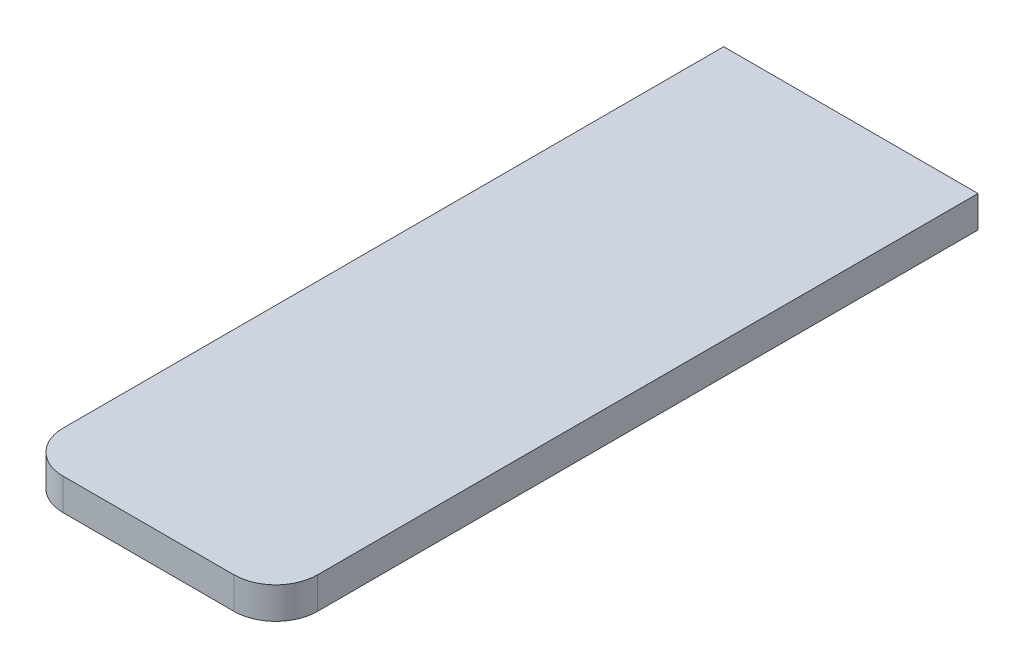
ISO-10303-21;
HEADER;
FILE_DESCRIPTION(('STEP AP214'),'2;1');
FILE_NAME('part.step','',(''),(''),'','','');
FILE_SCHEMA(('AUTOMOTIVE_DESIGN { 1 0 10303 214 1 1 1 1 }'));
ENDSEC;
DATA;
#1=APPLICATION_CONTEXT('core data for automotive mechanical design processes');
#2=APPLICATION_PROTOCOL_DEFINITION('international standard','automotive_design',2000,#1);
#3=PRODUCT_CONTEXT('',#1,'mechanical');
#4=PRODUCT('Part','Part','',(#3));
#5=PRODUCT_RELATED_PRODUCT_CATEGORY('part','',(#4));
#6=PRODUCT_DEFINITION_FORMATION('','',#4);
#7=PRODUCT_DEFINITION_CONTEXT('part definition',#1,'design');
#8=PRODUCT_DEFINITION('design','',#6,#7);
#9=PRODUCT_DEFINITION_SHAPE('','',#8);
#10=(LENGTH_UNIT() NAMED_UNIT(*) SI_UNIT(.MILLI.,.METRE.));
#11=(NAMED_UNIT(*) PLANE_ANGLE_UNIT() SI_UNIT($,.RADIAN.));
#12=(NAMED_UNIT(*) SI_UNIT($,.STERADIAN.) SOLID_ANGLE_UNIT());
#13=UNCERTAINTY_MEASURE_WITH_UNIT(LENGTH_MEASURE(1.E-05),#10,'distance_accuracy_value','');
#14=(GEOMETRIC_REPRESENTATION_CONTEXT(3) GLOBAL_UNCERTAINTY_ASSIGNED_CONTEXT((#13)) GLOBAL_UNIT_ASSIGNED_CONTEXT((#10,
#11,#12)) REPRESENTATION_CONTEXT('',''));
#15=CARTESIAN_POINT('',(0.,0.,0.));
#16=DIRECTION('',(0.,0.,1.));
#17=DIRECTION('',(1.,0.,0.));
#18=AXIS2_PLACEMENT_3D('',#15,#16,#17);
#19=CARTESIAN_POINT('',(12.05,3.,31.3));
#20=DIRECTION('',(-1.,0.,0.));
#21=DIRECTION('',(0.,0.,1.));
#22=AXIS2_PLACEMENT_3D('',#19,#20,#21);
#23=PLANE('',#22);
#24=DIRECTION('',(0.,0.,-1.));
#25=VECTOR('',#24,1.);
#26=CARTESIAN_POINT('',(12.05,3.,31.3));
#27=LINE('',#26,#25);
#28=CARTESIAN_POINT('',(12.05,3.,31.3));
#29=VERTEX_POINT('',#28);
#30=CARTESIAN_POINT('',(12.05,3.,-31.3));
#31=VERTEX_POINT('',#30);
#32=EDGE_CURVE('E84',#29,#31,#27,.T.);
#33=ORIENTED_EDGE('',*,*,#32,.F.);
#34=DIRECTION('',(0.,1.,0.));
#35=VECTOR('',#34,1.);
#36=CARTESIAN_POINT('',(12.05,0.,31.3));
#37=LINE('',#36,#35);
#38=CARTESIAN_POINT('',(12.05,0.,31.3));
#39=VERTEX_POINT('',#38);
#40=EDGE_CURVE('E116',#29,#39,#37,.F.);
#41=ORIENTED_EDGE('',*,*,#40,.T.);
#42=DIRECTION('',(0.,0.,-1.));
#43=VECTOR('',#42,1.);
#44=CARTESIAN_POINT('',(12.05,0.,31.3));
#45=LINE('',#44,#43);
#46=CARTESIAN_POINT('',(12.05,0.,-31.3));
#47=VERTEX_POINT('',#46);
#48=EDGE_CURVE('E106',#39,#47,#45,.T.);
#49=ORIENTED_EDGE('',*,*,#48,.T.);
#50=DIRECTION('',(0.,-1.,0.));
#51=VECTOR('',#50,1.);
#52=CARTESIAN_POINT('',(12.05,3.,-31.3));
#53=LINE('',#52,#51);
#54=EDGE_CURVE('E99',#31,#47,#53,.T.);
#55=ORIENTED_EDGE('',*,*,#54,.F.);
#56=EDGE_LOOP('',(#33,#41,#49,#55));
#57=FACE_BOUND('',#56,.T.);
#58=ADVANCED_FACE('F35',(#57),#23,.F.);
#59=CARTESIAN_POINT('',(-12.05,3.,-31.3));
#60=DIRECTION('',(0.,0.,1.));
#61=DIRECTION('',(1.,0.,0.));
#62=AXIS2_PLACEMENT_3D('',#59,#60,#61);
#63=PLANE('',#62);
#64=DIRECTION('',(-1.,0.,0.));
#65=VECTOR('',#64,1.);
#66=CARTESIAN_POINT('',(-12.05,0.,-31.3));
#67=LINE('',#66,#65);
#68=CARTESIAN_POINT('',(-12.05,0.,-31.3));
#69=VERTEX_POINT('',#68);
#70=EDGE_CURVE('E134',#47,#69,#67,.T.);
#71=ORIENTED_EDGE('',*,*,#70,.T.);
#72=DIRECTION('',(0.,-1.,0.));
#73=VECTOR('',#72,1.);
#74=CARTESIAN_POINT('',(-12.05,3.,-31.3));
#75=LINE('',#74,#73);
#76=CARTESIAN_POINT('',(-12.05,3.,-31.3));
#77=VERTEX_POINT('',#76);
#78=EDGE_CURVE('E101',#77,#69,#75,.T.);
#79=ORIENTED_EDGE('',*,*,#78,.F.);
#80=DIRECTION('',(-1.,0.,0.));
#81=VECTOR('',#80,1.);
#82=CARTESIAN_POINT('',(-12.05,3.,-31.3));
#83=LINE('',#82,#81);
#84=EDGE_CURVE('E87',#31,#77,#83,.T.);
#85=ORIENTED_EDGE('',*,*,#84,.F.);
#86=ORIENTED_EDGE('',*,*,#54,.T.);
#87=EDGE_LOOP('',(#71,#79,#85,#86));
#88=FACE_BOUND('',#87,.T.);
#89=ADVANCED_FACE('F98',(#88),#63,.F.);
#90=CARTESIAN_POINT('',(-12.05,3.,31.3));
#91=DIRECTION('',(1.,0.,0.));
#92=DIRECTION('',(0.,0.,-1.));
#93=AXIS2_PLACEMENT_3D('',#90,#91,#92);
#94=PLANE('',#93);
#95=DIRECTION('',(0.,0.,1.));
#96=VECTOR('',#95,1.);
#97=CARTESIAN_POINT('',(-12.05,0.,31.3));
#98=LINE('',#97,#96);
#99=CARTESIAN_POINT('',(-12.05,0.,31.3));
#100=VERTEX_POINT('',#99);
#101=EDGE_CURVE('E94',#69,#100,#98,.T.);
#102=ORIENTED_EDGE('',*,*,#101,.T.);
#103=DIRECTION('',(0.,1.,0.));
#104=VECTOR('',#103,1.);
#105=CARTESIAN_POINT('',(-12.05,3.,31.3));
#106=LINE('',#105,#104);
#107=CARTESIAN_POINT('',(-12.05,3.,31.3));
#108=VERTEX_POINT('',#107);
#109=EDGE_CURVE('E121',#100,#108,#106,.T.);
#110=ORIENTED_EDGE('',*,*,#109,.T.);
#111=DIRECTION('',(0.,0.,1.));
#112=VECTOR('',#111,1.);
#113=CARTESIAN_POINT('',(-12.05,3.,31.3));
#114=LINE('',#113,#112);
#115=EDGE_CURVE('E103',#77,#108,#114,.T.);
#116=ORIENTED_EDGE('',*,*,#115,.F.);
#117=ORIENTED_EDGE('',*,*,#78,.T.);
#118=EDGE_LOOP('',(#102,#110,#116,#117));
#119=FACE_BOUND('',#118,.T.);
#120=ADVANCED_FACE('F127',(#119),#94,.F.);
#121=CARTESIAN_POINT('',(0.,3.,0.));
#122=DIRECTION('',(0.,-1.,0.));
#123=DIRECTION('',(0.,0.,-1.));
#124=AXIS2_PLACEMENT_3D('',#121,#122,#123);
#125=PLANE('',#124);
#126=ORIENTED_EDGE('',*,*,#115,.T.);
#127=CARTESIAN_POINT('',(-8.1,3.,31.3));
#128=DIRECTION('',(0.,-1.,0.));
#129=DIRECTION('',(0.,0.,-1.));
#130=AXIS2_PLACEMENT_3D('',#127,#128,#129);
#131=CIRCLE('',#130,3.95);
#132=CARTESIAN_POINT('',(-8.1,3.,35.25));
#133=VERTEX_POINT('',#132);
#134=EDGE_CURVE('E57',#108,#133,#131,.F.);
#135=ORIENTED_EDGE('',*,*,#134,.T.);
#136=DIRECTION('',(1.,0.,0.));
#137=VECTOR('',#136,1.);
#138=CARTESIAN_POINT('',(12.05,3.,35.25));
#139=LINE('',#138,#137);
#140=CARTESIAN_POINT('',(8.1,3.,35.25));
#141=VERTEX_POINT('',#140);
#142=EDGE_CURVE('E161',#133,#141,#139,.T.);
#143=ORIENTED_EDGE('',*,*,#142,.T.);
#144=CARTESIAN_POINT('',(8.1,3.,31.3));
#145=DIRECTION('',(0.,-1.,0.));
#146=DIRECTION('',(0.,0.,-1.));
#147=AXIS2_PLACEMENT_3D('',#144,#145,#146);
#148=CIRCLE('',#147,3.95);
#149=EDGE_CURVE('E90',#141,#29,#148,.F.);
#150=ORIENTED_EDGE('',*,*,#149,.T.);
#151=ORIENTED_EDGE('',*,*,#32,.T.);
#152=ORIENTED_EDGE('',*,*,#84,.T.);
#153=EDGE_LOOP('',(#126,#135,#143,#150,#151,#152));
#154=FACE_BOUND('',#153,.T.);
#155=ADVANCED_FACE('F86',(#154),#125,.F.);
#156=CARTESIAN_POINT('',(0.,0.,0.));
#157=DIRECTION('',(0.,-1.,0.));
#158=DIRECTION('',(0.,0.,-1.));
#159=AXIS2_PLACEMENT_3D('',#156,#157,#158);
#160=PLANE('',#159);
#161=DIRECTION('',(1.,0.,0.));
#162=VECTOR('',#161,1.);
#163=CARTESIAN_POINT('',(12.05,0.,35.25));
#164=LINE('',#163,#162);
#165=CARTESIAN_POINT('',(-8.1,0.,35.25));
#166=VERTEX_POINT('',#165);
#167=CARTESIAN_POINT('',(8.1,0.,35.25));
#168=VERTEX_POINT('',#167);
#169=EDGE_CURVE('E135',#166,#168,#164,.T.);
#170=ORIENTED_EDGE('',*,*,#169,.F.);
#171=CARTESIAN_POINT('',(-8.1,0.,31.3));
#172=DIRECTION('',(0.,-1.,0.));
#173=DIRECTION('',(0.,0.,-1.));
#174=AXIS2_PLACEMENT_3D('',#171,#172,#173);
#175=CIRCLE('',#174,3.95);
#176=EDGE_CURVE('E11',#166,#100,#175,.T.);
#177=ORIENTED_EDGE('',*,*,#176,.T.);
#178=ORIENTED_EDGE('',*,*,#101,.F.);
#179=ORIENTED_EDGE('',*,*,#70,.F.);
#180=ORIENTED_EDGE('',*,*,#48,.F.);
#181=CARTESIAN_POINT('',(8.1,0.,31.3));
#182=DIRECTION('',(0.,-1.,0.));
#183=DIRECTION('',(0.,0.,-1.));
#184=AXIS2_PLACEMENT_3D('',#181,#182,#183);
#185=CIRCLE('',#184,3.95);
#186=EDGE_CURVE('E118',#39,#168,#185,.T.);
#187=ORIENTED_EDGE('',*,*,#186,.T.);
#188=EDGE_LOOP('',(#170,#177,#178,#179,#180,#187));
#189=FACE_BOUND('',#188,.T.);
#190=ADVANCED_FACE('F137',(#189),#160,.T.);
#191=CARTESIAN_POINT('',(12.05,0.,35.25));
#192=DIRECTION('',(0.,0.,1.));
#193=DIRECTION('',(1.,0.,0.));
#194=AXIS2_PLACEMENT_3D('',#191,#192,#193);
#195=PLANE('',#194);
#196=ORIENTED_EDGE('',*,*,#142,.F.);
#197=DIRECTION('',(0.,1.,0.));
#198=VECTOR('',#197,1.);
#199=CARTESIAN_POINT('',(-8.1,0.,35.25));
#200=LINE('',#199,#198);
#201=EDGE_CURVE('E43',#133,#166,#200,.F.);
#202=ORIENTED_EDGE('',*,*,#201,.T.);
#203=ORIENTED_EDGE('',*,*,#169,.T.);
#204=DIRECTION('',(0.,1.,0.));
#205=VECTOR('',#204,1.);
#206=CARTESIAN_POINT('',(8.1,3.,35.25));
#207=LINE('',#206,#205);
#208=EDGE_CURVE('E108',#168,#141,#207,.T.);
#209=ORIENTED_EDGE('',*,*,#208,.T.);
#210=EDGE_LOOP('',(#196,#202,#203,#209));
#211=FACE_BOUND('',#210,.T.);
#212=ADVANCED_FACE('F143',(#211),#195,.T.);
#213=CARTESIAN_POINT('',(8.1,0.,31.3));
#214=DIRECTION('',(0.,-1.,0.));
#215=DIRECTION('',(0.,0.,-1.));
#216=AXIS2_PLACEMENT_3D('',#213,#214,#215);
#217=CYLINDRICAL_SURFACE('',#216,3.95);
#218=ORIENTED_EDGE('',*,*,#186,.F.);
#219=ORIENTED_EDGE('',*,*,#40,.F.);
#220=ORIENTED_EDGE('',*,*,#149,.F.);
#221=ORIENTED_EDGE('',*,*,#208,.F.);
#222=EDGE_LOOP('',(#218,#219,#220,#221));
#223=FACE_BOUND('',#222,.T.);
#224=ADVANCED_FACE('F139',(#223),#217,.T.);
#225=CARTESIAN_POINT('',(-8.1,3.,31.3));
#226=DIRECTION('',(0.,-1.,0.));
#227=DIRECTION('',(0.,0.,-1.));
#228=AXIS2_PLACEMENT_3D('',#225,#226,#227);
#229=CYLINDRICAL_SURFACE('',#228,3.95);
#230=ORIENTED_EDGE('',*,*,#176,.F.);
#231=ORIENTED_EDGE('',*,*,#201,.F.);
#232=ORIENTED_EDGE('',*,*,#134,.F.);
#233=ORIENTED_EDGE('',*,*,#109,.F.);
#234=EDGE_LOOP('',(#230,#231,#232,#233));
#235=FACE_BOUND('',#234,.T.);
#236=ADVANCED_FACE('F37',(#235),#229,.T.);
#237=CLOSED_SHELL('',(#58,#89,#120,#155,#190,#212,#224,#236));
#238=MANIFOLD_SOLID_BREP('B2',#237);
#239=ADVANCED_BREP_SHAPE_REPRESENTATION('',(#18,#238),#14);
#240=SHAPE_DEFINITION_REPRESENTATION(#9,#239);
ENDSEC;
END-ISO-10303-21;
